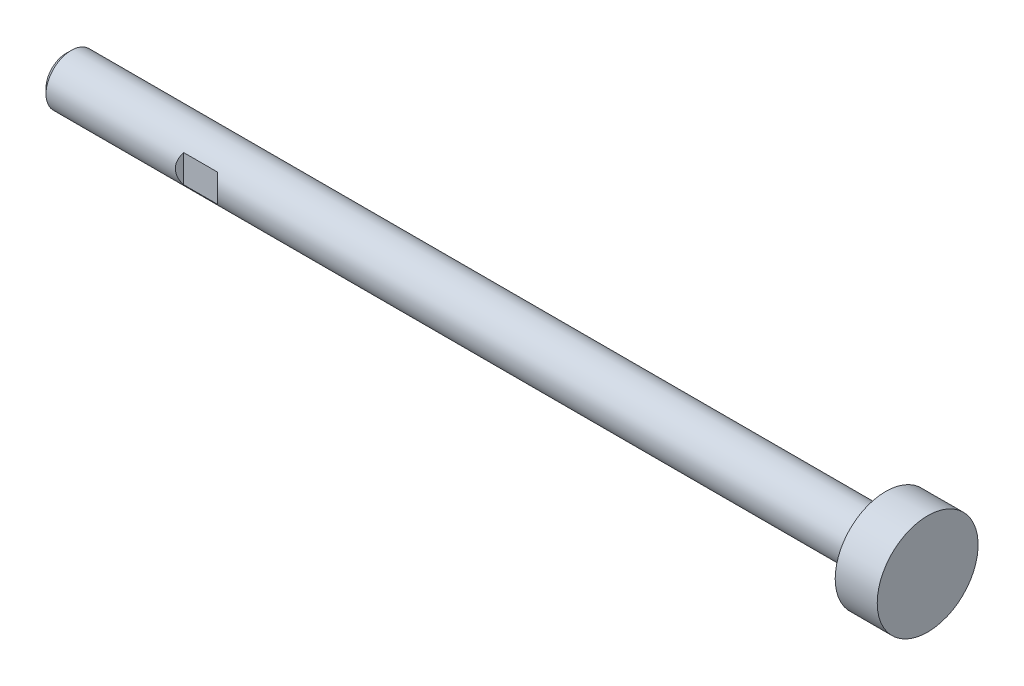
ISO-10303-21;
HEADER;
FILE_DESCRIPTION(('STEP AP214'),'2;1');
FILE_NAME('part.step','',(''),(''),'','','');
FILE_SCHEMA(('AUTOMOTIVE_DESIGN { 1 0 10303 214 1 1 1 1 }'));
ENDSEC;
DATA;
#1=APPLICATION_CONTEXT('core data for automotive mechanical design processes');
#2=APPLICATION_PROTOCOL_DEFINITION('international standard','automotive_design',2000,#1);
#3=PRODUCT_CONTEXT('',#1,'mechanical');
#4=PRODUCT('Part','Part','',(#3));
#5=PRODUCT_RELATED_PRODUCT_CATEGORY('part','',(#4));
#6=PRODUCT_DEFINITION_FORMATION('','',#4);
#7=PRODUCT_DEFINITION_CONTEXT('part definition',#1,'design');
#8=PRODUCT_DEFINITION('design','',#6,#7);
#9=PRODUCT_DEFINITION_SHAPE('','',#8);
#10=(LENGTH_UNIT() NAMED_UNIT(*) SI_UNIT(.MILLI.,.METRE.));
#11=(NAMED_UNIT(*) PLANE_ANGLE_UNIT() SI_UNIT($,.RADIAN.));
#12=(NAMED_UNIT(*) SI_UNIT($,.STERADIAN.) SOLID_ANGLE_UNIT());
#13=UNCERTAINTY_MEASURE_WITH_UNIT(LENGTH_MEASURE(1.E-05),#10,'distance_accuracy_value','');
#14=(GEOMETRIC_REPRESENTATION_CONTEXT(3) GLOBAL_UNCERTAINTY_ASSIGNED_CONTEXT((#13)) GLOBAL_UNIT_ASSIGNED_CONTEXT((#10,
#11,#12)) REPRESENTATION_CONTEXT('',''));
#15=CARTESIAN_POINT('',(0.,0.,0.));
#16=DIRECTION('',(0.,0.,1.));
#17=DIRECTION('',(1.,0.,0.));
#18=AXIS2_PLACEMENT_3D('',#15,#16,#17);
#19=CARTESIAN_POINT('',(-38.,-2.3865,2.3865));
#20=DIRECTION('',(-1.,0.,0.));
#21=DIRECTION('',(0.,1.,0.));
#22=AXIS2_PLACEMENT_3D('',#19,#20,#21);
#23=PLANE('',#22);
#24=CARTESIAN_POINT('',(-38.,0.,0.));
#25=DIRECTION('',(-1.,0.,0.));
#26=DIRECTION('',(0.,0.,-1.));
#27=AXIS2_PLACEMENT_3D('',#24,#25,#26);
#28=CIRCLE('',#27,2.3865);
#29=CARTESIAN_POINT('',(-38.,0.,-2.3865));
#30=VERTEX_POINT('',#29);
#31=EDGE_CURVE('E301',#30,#30,#28,.F.);
#32=ORIENTED_EDGE('',*,*,#31,.F.);
#33=EDGE_LOOP('',(#32));
#34=FACE_BOUND('',#33,.T.);
#35=ADVANCED_FACE('F17',(#34),#23,.T.);
#36=CARTESIAN_POINT('',(59.5,-6.16394374595285,6.));
#37=DIRECTION('',(-1.,0.,0.));
#38=DIRECTION('',(0.,1.,0.));
#39=AXIS2_PLACEMENT_3D('',#36,#37,#38);
#40=PLANE('',#39);
#41=CARTESIAN_POINT('',(59.5,0.,0.));
#42=DIRECTION('',(-1.,0.,0.));
#43=DIRECTION('',(0.,0.,-1.));
#44=AXIS2_PLACEMENT_3D('',#41,#42,#43);
#45=CIRCLE('',#44,6.);
#46=CARTESIAN_POINT('',(59.5,0.,-6.));
#47=VERTEX_POINT('',#46);
#48=EDGE_CURVE('E303',#47,#47,#45,.F.);
#49=ORIENTED_EDGE('',*,*,#48,.F.);
#50=EDGE_LOOP('',(#49));
#51=FACE_BOUND('',#50,.T.);
#52=CARTESIAN_POINT('',(59.5,0.,0.));
#53=DIRECTION('',(1.,0.,0.));
#54=DIRECTION('',(0.,0.,1.));
#55=AXIS2_PLACEMENT_3D('',#52,#53,#54);
#56=CIRCLE('',#55,3.);
#57=CARTESIAN_POINT('',(59.5,0.,3.));
#58=VERTEX_POINT('',#57);
#59=EDGE_CURVE('E306',#58,#58,#56,.T.);
#60=ORIENTED_EDGE('',*,*,#59,.T.);
#61=EDGE_LOOP('',(#60));
#62=FACE_BOUND('',#61,.T.);
#63=ADVANCED_FACE('F292',(#51,#62),#40,.T.);
#64=CARTESIAN_POINT('',(64.5,-6.16394374595285,-6.));
#65=DIRECTION('',(1.,0.,0.));
#66=DIRECTION('',(0.,1.,0.));
#67=AXIS2_PLACEMENT_3D('',#64,#65,#66);
#68=PLANE('',#67);
#69=CARTESIAN_POINT('',(64.5,0.,0.));
#70=DIRECTION('',(1.,0.,0.));
#71=DIRECTION('',(0.,0.,1.));
#72=AXIS2_PLACEMENT_3D('',#69,#70,#71);
#73=CIRCLE('',#72,6.);
#74=CARTESIAN_POINT('',(64.5,0.,6.));
#75=VERTEX_POINT('',#74);
#76=EDGE_CURVE('E97',#75,#75,#73,.T.);
#77=ORIENTED_EDGE('',*,*,#76,.T.);
#78=EDGE_LOOP('',(#77));
#79=FACE_BOUND('',#78,.T.);
#80=ADVANCED_FACE('F122',(#79),#68,.T.);
#81=CARTESIAN_POINT('',(-17.,-1.65831288801899,-3.00000000000001));
#82=DIRECTION('',(-0.707106781186547,0.,-0.707106781186548));
#83=DIRECTION('',(-0.707106781186548,0.,0.707106781186547));
#84=AXIS2_PLACEMENT_3D('',#81,#82,#83);
#85=PLANE('',#84);
#86=CARTESIAN_POINT('',(-17.,0.,-3.));
#87=CARTESIAN_POINT('',(-17.0000000059859,-0.0867549360691791,-2.99999999401415));
#88=CARTESIAN_POINT('',(-17.0036753764295,-0.17242580957928,-2.99632462357046));
#89=CARTESIAN_POINT('',(-17.0193425851593,-0.355900353264831,-2.98065741484074));
#90=CARTESIAN_POINT('',(-17.0325688449145,-0.452763991780153,-2.96743115508547));
#91=CARTESIAN_POINT('',(-17.0856745593242,-0.737915160586094,-2.91432544067583));
#92=CARTESIAN_POINT('',(-17.132862376226,-0.89748433131676,-2.86713762377402));
#93=CARTESIAN_POINT('',(-17.2749633057536,-1.2785626003522,-2.72503669424642));
#94=CARTESIAN_POINT('',(-17.3795731829535,-1.47676221679653,-2.62042681704651));
#95=CARTESIAN_POINT('',(-17.5000002676739,-1.65831288801899,-2.49999973232612));
#96=B_SPLINE_CURVE_WITH_KNOTS('',3,(#86,#87,#88,#89,#90,#91,#92,#93,#94,#95),.UNSPECIFIED.,.F.,
.F.,(4,2,2,2,4),(0.,0.124247096673468,0.269383371508034,0.558489745229879,1.),.UNSPECIFIED.);
#97=CARTESIAN_POINT('',(-17.,0.,-3.));
#98=VERTEX_POINT('',#97);
#99=CARTESIAN_POINT('',(-17.5000002676739,-1.65831288801899,-2.49999973232612));
#100=VERTEX_POINT('',#99);
#101=EDGE_CURVE('E78',#98,#100,#96,.T.);
#102=ORIENTED_EDGE('',*,*,#101,.T.);
#103=DIRECTION('',(8.07066875423836E-08,0.999999999999994,-8.07066874084857E-08));
#104=VECTOR('',#103,1.);
#105=CARTESIAN_POINT('',(-17.5000002676739,-1.65831288801899,-2.49999973232612));
#106=LINE('',#105,#104);
#107=CARTESIAN_POINT('',(-17.5,1.65831239517788,-2.49999999999996));
#108=VERTEX_POINT('',#107);
#109=EDGE_CURVE('E94',#108,#100,#106,.F.);
#110=ORIENTED_EDGE('',*,*,#109,.F.);
#111=CARTESIAN_POINT('',(-17.5,1.65831239517788,-2.49999999999996));
#112=CARTESIAN_POINT('',(-17.4190265274597,1.53624029227424,-2.5809734725403));
#113=CARTESIAN_POINT('',(-17.347102739704,1.40840137325512,-2.65289726029605));
#114=CARTESIAN_POINT('',(-17.215641137627,1.12862575555821,-2.78435886237297));
#115=CARTESIAN_POINT('',(-17.156617371645,0.973086559164694,-2.84338262835505));
#116=CARTESIAN_POINT('',(-17.080502145566,0.698618720029683,-2.91949785443397));
#117=CARTESIAN_POINT('',(-17.0572723493561,0.594430089391322,-2.94272765064391));
#118=CARTESIAN_POINT('',(-17.0267831941036,0.409053029856392,-2.9732168058964));
#119=CARTESIAN_POINT('',(-17.0169098669183,0.330358124647728,-2.98309013308169));
#120=CARTESIAN_POINT('',(-17.0035182698665,0.168719648420423,-2.99648173013349));
#121=CARTESIAN_POINT('',(-17.,0.0857760774017828,-3.00000000000001));
#122=CARTESIAN_POINT('',(-17.,0.,-3.));
#123=B_SPLINE_CURVE_WITH_KNOTS('',3,(#111,#112,#113,#114,#115,#116,#117,#118,#119,#120,#121,
#122),.UNSPECIFIED.,.F.,.F.,(4,2,2,2,2,4),(0.,0.270080127830904,0.569934810766989,
0.746931933308913,0.873465966654456,1.),.UNSPECIFIED.);
#124=EDGE_CURVE('E95',#108,#98,#123,.T.);
#125=ORIENTED_EDGE('',*,*,#124,.T.);
#126=EDGE_LOOP('',(#102,#110,#125));
#127=FACE_BOUND('',#126,.T.);
#128=ADVANCED_FACE('F93',(#127),#85,.T.);
#129=CARTESIAN_POINT('',(-17.5000000000001,-1.65831288801899,-2.5));
#130=DIRECTION('',(0.,0.,-1.));
#131=DIRECTION('',(-1.,0.,0.));
#132=AXIS2_PLACEMENT_3D('',#129,#130,#131);
#133=PLANE('',#132);
#134=DIRECTION('',(1.,-2.92163471760097E-09,0.));
#135=VECTOR('',#134,1.);
#136=CARTESIAN_POINT('',(-21.4999999922479,1.65831240686442,-2.5));
#137=LINE('',#136,#135);
#138=CARTESIAN_POINT('',(-21.4999999922479,1.65831240686442,-2.5));
#139=VERTEX_POINT('',#138);
#140=EDGE_CURVE('E88',#139,#108,#137,.T.);
#141=ORIENTED_EDGE('',*,*,#140,.T.);
#142=ORIENTED_EDGE('',*,*,#109,.T.);
#143=DIRECTION('',(-1.,0.,0.));
#144=VECTOR('',#143,1.);
#145=CARTESIAN_POINT('',(-17.5000002380538,-1.658312888019,-2.5));
#146=LINE('',#145,#144);
#147=CARTESIAN_POINT('',(-21.499999673086,-1.65831288801884,-2.5));
#148=VERTEX_POINT('',#147);
#149=EDGE_CURVE('E75',#100,#148,#146,.T.);
#150=ORIENTED_EDGE('',*,*,#149,.T.);
#151=DIRECTION('',(-9.62309100030694E-08,0.999999999999995,0.));
#152=VECTOR('',#151,1.);
#153=CARTESIAN_POINT('',(-21.499999673086,-1.65831288801884,-2.5));
#154=LINE('',#153,#152);
#155=EDGE_CURVE('E87',#139,#148,#154,.F.);
#156=ORIENTED_EDGE('',*,*,#155,.F.);
#157=EDGE_LOOP('',(#141,#142,#150,#156));
#158=FACE_BOUND('',#157,.T.);
#159=ADVANCED_FACE('F101',(#158),#133,.T.);
#160=CARTESIAN_POINT('',(-21.4999997548145,-1.65831288801884,-2.49999975481454));
#161=DIRECTION('',(0.70710678118655,0.,-0.707106781186545));
#162=DIRECTION('',(-0.707106781186545,0.,-0.70710678118655));
#163=AXIS2_PLACEMENT_3D('',#160,#161,#162);
#164=PLANE('',#163);
#165=ORIENTED_EDGE('',*,*,#155,.T.);
#166=CARTESIAN_POINT('',(-21.4999997548145,-1.65831288801884,-2.49999975481454));
#167=CARTESIAN_POINT('',(-21.580973241401,-1.53624073400989,-2.58097324140097));
#168=CARTESIAN_POINT('',(-21.6528970440837,-1.40840177683506,-2.65289704408371));
#169=CARTESIAN_POINT('',(-21.7843587033736,-1.12862605546334,-2.78435870337357));
#170=CARTESIAN_POINT('',(-21.843382504325,-0.973086791376181,-2.84338250432504));
#171=CARTESIAN_POINT('',(-21.9194977778227,-0.698618863122431,-2.91949777782268));
#172=CARTESIAN_POINT('',(-21.9427275893732,-0.594430202015266,-2.94272758937316));
#173=CARTESIAN_POINT('',(-21.9732167675547,-0.409053098522211,-2.97321676755465));
#174=CARTESIAN_POINT('',(-21.9830901033396,-0.330358173218348,-2.98309010333958));
#175=CARTESIAN_POINT('',(-21.9964817160028,-0.168719665577011,-2.99648171600284));
#176=CARTESIAN_POINT('',(-21.9999999928769,-0.085776083115368,-2.99999999287691));
#177=CARTESIAN_POINT('',(-22.,0.,-2.99999999999999));
#178=B_SPLINE_CURVE_WITH_KNOTS('',3,(#166,#167,#168,#169,#170,#171,#172,#173,#174,#175,#176,
#177),.UNSPECIFIED.,.F.,.F.,(4,2,2,2,2,4),(0.,0.270080048915377,0.569934744899637,
0.746931883971709,0.873465941985855,1.),.UNSPECIFIED.);
#179=CARTESIAN_POINT('',(-22.,0.,-3.));
#180=VERTEX_POINT('',#179);
#181=EDGE_CURVE('E81',#148,#180,#178,.T.);
#182=ORIENTED_EDGE('',*,*,#181,.T.);
#183=CARTESIAN_POINT('',(-22.,0.,-2.99999999999999));
#184=CARTESIAN_POINT('',(-22.0000000005131,0.0867548653900026,-3.0000000005131));
#185=CARTESIAN_POINT('',(-21.9963246416156,0.172425670052859,-2.99632464161557));
#186=CARTESIAN_POINT('',(-21.9806574706447,0.355900048834618,-2.98065747064473));
#187=CARTESIAN_POINT('',(-21.9674312386972,0.452763613805404,-2.9674312386972));
#188=CARTESIAN_POINT('',(-21.9143256287173,0.737914534129651,-2.91432562871725));
#189=CARTESIAN_POINT('',(-21.8671378982172,0.897483575960319,-2.8671378982172));
#190=CARTESIAN_POINT('',(-21.7250370656245,1.27856192011425,-2.72503706562452));
#191=CARTESIAN_POINT('',(-21.6204271487271,1.47676164663555,-2.62042714872713));
#192=CARTESIAN_POINT('',(-21.4999999941859,1.65831240686442,-2.49999999418593));
#193=B_SPLINE_CURVE_WITH_KNOTS('',3,(#183,#184,#185,#186,#187,#188,#189,#190,#191,#192),
.UNSPECIFIED.,.F.,.F.,(4,2,2,2,4),(0.,0.124247046808146,0.269383237501366,0.558489366026106,1.),.UNSPECIFIED.);
#194=EDGE_CURVE('E277',#180,#139,#193,.T.);
#195=ORIENTED_EDGE('',*,*,#194,.T.);
#196=EDGE_LOOP('',(#165,#182,#195));
#197=FACE_BOUND('',#196,.T.);
#198=ADVANCED_FACE('F127',(#197),#164,.T.);
#199=CARTESIAN_POINT('',(-17.5000000000001,-1.65831239517788,2.49999999999995));
#200=DIRECTION('',(-0.707106781186547,0.,0.707106781186548));
#201=DIRECTION('',(0.707106781186548,0.,0.707106781186547));
#202=AXIS2_PLACEMENT_3D('',#199,#200,#201);
#203=PLANE('',#202);
#204=CARTESIAN_POINT('',(-17.,0.,3.));
#205=CARTESIAN_POINT('',(-17.,0.0867549250480196,3.));
#206=CARTESIAN_POINT('',(-17.0036753642979,0.172425787242578,2.99632463570206));
#207=CARTESIAN_POINT('',(-17.0193425584787,0.355900304140552,2.98065744152131));
#208=CARTESIAN_POINT('',(-17.0325688092168,0.452763926053411,2.96743119078324));
#209=CARTESIAN_POINT('',(-17.085674492356,0.73791503728435,2.91432550764395));
#210=CARTESIAN_POINT('',(-17.1328622850167,0.897484163382121,2.86713771498334));
#211=CARTESIAN_POINT('',(-17.2749631443941,1.27856230325701,2.72503685560593));
#212=CARTESIAN_POINT('',(-17.3795729718018,1.47676182802399,2.62042702819819));
#213=CARTESIAN_POINT('',(-17.5000000000001,1.65831239517785,2.49999999999995));
#214=B_SPLINE_CURVE_WITH_KNOTS('',3,(#204,#205,#206,#207,#208,#209,#210,#211,#212,#213),
.UNSPECIFIED.,.F.,.F.,(4,2,2,2,4),(0.,0.124247096673471,0.26938337150804,0.558489745229894,1.),.UNSPECIFIED.);
#215=CARTESIAN_POINT('',(-17.,0.,3.));
#216=VERTEX_POINT('',#215);
#217=CARTESIAN_POINT('',(-17.5000000000001,1.65831239517785,2.49999999999995));
#218=VERTEX_POINT('',#217);
#219=EDGE_CURVE('E156',#216,#218,#214,.T.);
#220=ORIENTED_EDGE('',*,*,#219,.T.);
#221=DIRECTION('',(0.,-1.,0.));
#222=VECTOR('',#221,1.);
#223=CARTESIAN_POINT('',(-17.5000000000001,1.65831239517785,2.49999999999995));
#224=LINE('',#223,#222);
#225=CARTESIAN_POINT('',(-17.5,-1.65831239517788,2.49999999999996));
#226=VERTEX_POINT('',#225);
#227=EDGE_CURVE('E161',#218,#226,#224,.T.);
#228=ORIENTED_EDGE('',*,*,#227,.T.);
#229=CARTESIAN_POINT('',(-17.5,-1.65831239517788,2.49999999999996));
#230=CARTESIAN_POINT('',(-17.4190265274597,-1.53624029227424,2.5809734725403));
#231=CARTESIAN_POINT('',(-17.3471027397039,-1.40840137325511,2.65289726029605));
#232=CARTESIAN_POINT('',(-17.215641137627,-1.1286257555582,2.78435886237297));
#233=CARTESIAN_POINT('',(-17.156617371645,-0.973086559164696,2.84338262835504));
#234=CARTESIAN_POINT('',(-17.080502145566,-0.698618720029682,2.91949785443396));
#235=CARTESIAN_POINT('',(-17.0572723493561,-0.594430089391321,2.94272765064391));
#236=CARTESIAN_POINT('',(-17.0267831941036,-0.409053029856391,2.9732168058964));
#237=CARTESIAN_POINT('',(-17.0169098669183,-0.330358124647727,2.98309013308169));
#238=CARTESIAN_POINT('',(-17.0035182698665,-0.168719648420423,2.99648173013349));
#239=CARTESIAN_POINT('',(-17.,-0.0857760774017823,3.));
#240=CARTESIAN_POINT('',(-17.,0.,3.));
#241=B_SPLINE_CURVE_WITH_KNOTS('',3,(#229,#230,#231,#232,#233,#234,#235,#236,#237,#238,#239,
#240),.UNSPECIFIED.,.F.,.F.,(4,2,2,2,2,4),(0.,0.270080127830901,0.569934810766989,
0.746931933308913,0.873465966654457,1.),.UNSPECIFIED.);
#242=EDGE_CURVE('E168',#226,#216,#241,.T.);
#243=ORIENTED_EDGE('',*,*,#242,.T.);
#244=EDGE_LOOP('',(#220,#228,#243));
#245=FACE_BOUND('',#244,.T.);
#246=ADVANCED_FACE('F131',(#245),#203,.T.);
#247=CARTESIAN_POINT('',(-21.5,-1.65831241292626,2.5));
#248=DIRECTION('',(0.,0.,1.));
#249=DIRECTION('',(1.,0.,0.));
#250=AXIS2_PLACEMENT_3D('',#247,#248,#249);
#251=PLANE('',#250);
#252=DIRECTION('',(1.,4.4370960925056E-09,0.));
#253=VECTOR('',#252,1.);
#254=CARTESIAN_POINT('',(-21.4999999882269,-1.65831241292626,2.5));
#255=LINE('',#254,#253);
#256=CARTESIAN_POINT('',(-21.4999999882269,-1.65831241292626,2.5));
#257=VERTEX_POINT('',#256);
#258=EDGE_CURVE('E44',#257,#226,#255,.T.);
#259=ORIENTED_EDGE('',*,*,#258,.T.);
#260=ORIENTED_EDGE('',*,*,#227,.F.);
#261=DIRECTION('',(-1.,0.,0.));
#262=VECTOR('',#261,1.);
#263=CARTESIAN_POINT('',(-17.5,1.65831239517785,2.5));
#264=LINE('',#263,#262);
#265=CARTESIAN_POINT('',(-21.5,1.65831239517771,2.5));
#266=VERTEX_POINT('',#265);
#267=EDGE_CURVE('E181',#218,#266,#264,.T.);
#268=ORIENTED_EDGE('',*,*,#267,.T.);
#269=DIRECTION('',(3.54972206891777E-09,-1.,0.));
#270=VECTOR('',#269,1.);
#271=CARTESIAN_POINT('',(-21.5,1.65831239517771,2.5));
#272=LINE('',#271,#270);
#273=EDGE_CURVE('E186',#266,#257,#272,.T.);
#274=ORIENTED_EDGE('',*,*,#273,.T.);
#275=EDGE_LOOP('',(#259,#260,#268,#274));
#276=FACE_BOUND('',#275,.T.);
#277=ADVANCED_FACE('F206',(#276),#251,.T.);
#278=CARTESIAN_POINT('',(-22.0000000004456,-1.65831241292626,3.00000000044562));
#279=DIRECTION('',(0.70710678118655,0.,0.707106781186545));
#280=DIRECTION('',(0.707106781186545,0.,-0.70710678118655));
#281=AXIS2_PLACEMENT_3D('',#278,#279,#280);
#282=PLANE('',#281);
#283=ORIENTED_EDGE('',*,*,#273,.F.);
#284=CARTESIAN_POINT('',(-21.5,1.65831239517771,2.50000000000001));
#285=CARTESIAN_POINT('',(-21.5809734725403,1.53624029227411,2.58097347254033));
#286=CARTESIAN_POINT('',(-21.6528972602961,1.40840137325498,2.65289726029609));
#287=CARTESIAN_POINT('',(-21.7843588634652,1.1286257532337,2.78435886346519));
#288=CARTESIAN_POINT('',(-21.8433826294321,0.973086555280863,2.8433826294321));
#289=CARTESIAN_POINT('',(-21.9194978552074,0.698618717240803,2.91949785520737));
#290=CARTESIAN_POINT('',(-21.9427276513113,0.594430085333599,2.94272765131129));
#291=CARTESIAN_POINT('',(-21.9732168067102,0.40905302490842,2.97321680671019));
#292=CARTESIAN_POINT('',(-21.9830901338955,0.330358115823856,2.98309013389548));
#293=CARTESIAN_POINT('',(-21.9964817305404,0.16871963819463,2.99648173054038));
#294=CARTESIAN_POINT('',(-22.,0.0857760696499684,3.));
#295=CARTESIAN_POINT('',(-22.,0.,2.99999999999999));
#296=B_SPLINE_CURVE_WITH_KNOTS('',3,(#284,#285,#286,#287,#288,#289,#290,#291,#292,#293,#294,
#295),.UNSPECIFIED.,.F.,.F.,(4,2,2,2,2,4),(0.,0.270080111982672,0.569934782058521,
0.746931905837498,0.873465952918749,1.),.UNSPECIFIED.);
#297=CARTESIAN_POINT('',(-22.,0.,3.));
#298=VERTEX_POINT('',#297);
#299=EDGE_CURVE('E36',#266,#298,#296,.T.);
#300=ORIENTED_EDGE('',*,*,#299,.T.);
#301=CARTESIAN_POINT('',(-22.,0.,2.99999999999999));
#302=CARTESIAN_POINT('',(-22.0000000004456,-0.0867548655254598,3.00000000044562));
#303=CARTESIAN_POINT('',(-21.9963246414788,-0.172425670327397,2.99632464147883));
#304=CARTESIAN_POINT('',(-21.980657470344,-0.355900049438406,2.98065747034404));
#305=CARTESIAN_POINT('',(-21.9674312382949,-0.452763614613331,2.96743123829491));
#306=CARTESIAN_POINT('',(-21.9143256279627,-0.737914535645528,2.91432562796265));
#307=CARTESIAN_POINT('',(-21.8671378971895,-0.897483578025181,2.86713789718949));
#308=CARTESIAN_POINT('',(-21.7250370638065,-1.27856192376787,2.72503706380651));
#309=CARTESIAN_POINT('',(-21.6204271463482,-1.47676165141702,2.62042714634817));
#310=CARTESIAN_POINT('',(-21.4999999911702,-1.65831241292626,2.4999999911702));
#311=B_SPLINE_CURVE_WITH_KNOTS('',3,(#301,#302,#303,#304,#305,#306,#307,#308,#309,#310),
.UNSPECIFIED.,.F.,.F.,(4,2,2,2,4),(0.,0.124247046808282,0.26938323750159,0.558489366026297,1.),.UNSPECIFIED.);
#312=EDGE_CURVE('E28',#298,#257,#311,.T.);
#313=ORIENTED_EDGE('',*,*,#312,.T.);
#314=EDGE_LOOP('',(#283,#300,#313));
#315=FACE_BOUND('',#314,.T.);
#316=ADVANCED_FACE('F198',(#315),#282,.T.);
#317=CARTESIAN_POINT('',(64.5,0.,0.));
#318=DIRECTION('',(1.,0.,0.));
#319=DIRECTION('',(0.,0.,1.));
#320=AXIS2_PLACEMENT_3D('',#317,#318,#319);
#321=CYLINDRICAL_SURFACE('',#320,3.);
#322=ORIENTED_EDGE('',*,*,#59,.F.);
#323=EDGE_LOOP('',(#322));
#324=FACE_BOUND('',#323,.T.);
#325=ORIENTED_EDGE('',*,*,#242,.F.);
#326=ORIENTED_EDGE('',*,*,#258,.F.);
#327=ORIENTED_EDGE('',*,*,#312,.F.);
#328=ORIENTED_EDGE('',*,*,#299,.F.);
#329=ORIENTED_EDGE('',*,*,#267,.F.);
#330=ORIENTED_EDGE('',*,*,#219,.F.);
#331=EDGE_LOOP('',(#325,#326,#327,#328,#329,#330));
#332=FACE_BOUND('',#331,.T.);
#333=CARTESIAN_POINT('',(-37.3865,0.,0.));
#334=DIRECTION('',(1.,0.,0.));
#335=DIRECTION('',(0.,0.,1.));
#336=AXIS2_PLACEMENT_3D('',#333,#334,#335);
#337=CIRCLE('',#336,3.);
#338=CARTESIAN_POINT('',(-37.3865,0.,3.));
#339=VERTEX_POINT('',#338);
#340=EDGE_CURVE('E11',#339,#339,#337,.T.);
#341=ORIENTED_EDGE('',*,*,#340,.T.);
#342=EDGE_LOOP('',(#341));
#343=FACE_BOUND('',#342,.T.);
#344=ORIENTED_EDGE('',*,*,#181,.F.);
#345=ORIENTED_EDGE('',*,*,#149,.F.);
#346=ORIENTED_EDGE('',*,*,#101,.F.);
#347=ORIENTED_EDGE('',*,*,#124,.F.);
#348=ORIENTED_EDGE('',*,*,#140,.F.);
#349=ORIENTED_EDGE('',*,*,#194,.F.);
#350=EDGE_LOOP('',(#344,#345,#346,#347,#348,#349));
#351=FACE_BOUND('',#350,.T.);
#352=ADVANCED_FACE('F77',(#324,#332,#343,#351),#321,.T.);
#353=CARTESIAN_POINT('',(-37.3865,0.,0.));
#354=DIRECTION('',(1.,0.,0.));
#355=DIRECTION('',(0.,0.,1.));
#356=AXIS2_PLACEMENT_3D('',#353,#354,#355);
#357=CONICAL_SURFACE('',#356,2.99999999999999,0.785398163397435);
#358=ORIENTED_EDGE('',*,*,#31,.T.);
#359=EDGE_LOOP('',(#358));
#360=FACE_BOUND('',#359,.T.);
#361=ORIENTED_EDGE('',*,*,#340,.F.);
#362=EDGE_LOOP('',(#361));
#363=FACE_BOUND('',#362,.T.);
#364=ADVANCED_FACE('F316',(#360,#363),#357,.T.);
#365=CARTESIAN_POINT('',(64.5,0.,0.));
#366=DIRECTION('',(1.,0.,0.));
#367=DIRECTION('',(0.,0.,1.));
#368=AXIS2_PLACEMENT_3D('',#365,#366,#367);
#369=CYLINDRICAL_SURFACE('',#368,6.);
#370=ORIENTED_EDGE('',*,*,#76,.F.);
#371=EDGE_LOOP('',(#370));
#372=FACE_BOUND('',#371,.T.);
#373=ORIENTED_EDGE('',*,*,#48,.T.);
#374=EDGE_LOOP('',(#373));
#375=FACE_BOUND('',#374,.T.);
#376=ADVANCED_FACE('F19',(#372,#375),#369,.T.);
#377=CLOSED_SHELL('',(#35,#63,#80,#128,#159,#198,#246,#277,#316,#352,#364,#376));
#378=MANIFOLD_SOLID_BREP('B1',#377);
#379=ADVANCED_BREP_SHAPE_REPRESENTATION('',(#18,#378),#14);
#380=SHAPE_DEFINITION_REPRESENTATION(#9,#379);
ENDSEC;
END-ISO-10303-21;
